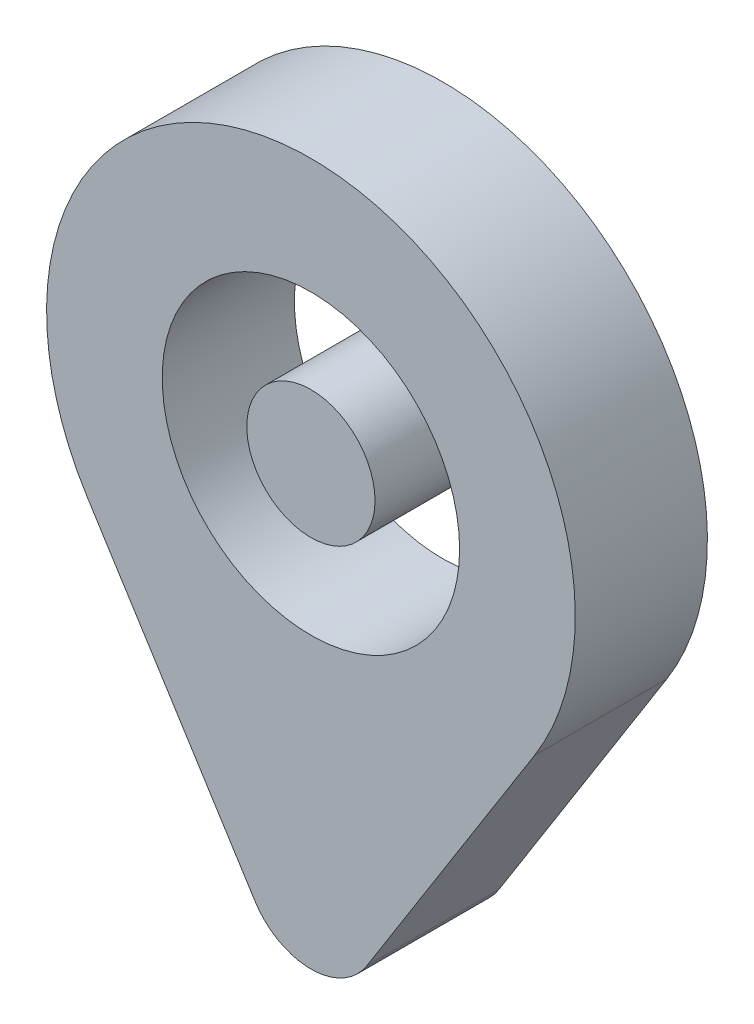
ISO-10303-21;
HEADER;
FILE_DESCRIPTION(('STEP AP214'),'2;1');
FILE_NAME('part.step','',(''),(''),'','','');
FILE_SCHEMA(('AUTOMOTIVE_DESIGN { 1 0 10303 214 1 1 1 1 }'));
ENDSEC;
DATA;
#1=APPLICATION_CONTEXT('core data for automotive mechanical design processes');
#2=APPLICATION_PROTOCOL_DEFINITION('international standard','automotive_design',2000,#1);
#3=PRODUCT_CONTEXT('',#1,'mechanical');
#4=PRODUCT('Part','Part','',(#3));
#5=PRODUCT_RELATED_PRODUCT_CATEGORY('part','',(#4));
#6=PRODUCT_DEFINITION_FORMATION('','',#4);
#7=PRODUCT_DEFINITION_CONTEXT('part definition',#1,'design');
#8=PRODUCT_DEFINITION('design','',#6,#7);
#9=PRODUCT_DEFINITION_SHAPE('','',#8);
#10=(LENGTH_UNIT() NAMED_UNIT(*) SI_UNIT(.MILLI.,.METRE.));
#11=(NAMED_UNIT(*) PLANE_ANGLE_UNIT() SI_UNIT($,.RADIAN.));
#12=(NAMED_UNIT(*) SI_UNIT($,.STERADIAN.) SOLID_ANGLE_UNIT());
#13=UNCERTAINTY_MEASURE_WITH_UNIT(LENGTH_MEASURE(1.E-05),#10,'distance_accuracy_value','');
#14=(GEOMETRIC_REPRESENTATION_CONTEXT(3) GLOBAL_UNCERTAINTY_ASSIGNED_CONTEXT((#13)) GLOBAL_UNIT_ASSIGNED_CONTEXT((#10,
#11,#12)) REPRESENTATION_CONTEXT('',''));
#15=CARTESIAN_POINT('',(0.,0.,0.));
#16=DIRECTION('',(0.,0.,1.));
#17=DIRECTION('',(1.,0.,0.));
#18=AXIS2_PLACEMENT_3D('',#15,#16,#17);
#19=CARTESIAN_POINT('',(0.,15.,-2.));
#20=DIRECTION('',(0.,0.,1.));
#21=DIRECTION('',(1.,0.,0.));
#22=AXIS2_PLACEMENT_3D('',#19,#20,#21);
#23=CYLINDRICAL_SURFACE('',#22,1.9402991177563);
#24=CARTESIAN_POINT('',(0.,15.,-2.));
#25=DIRECTION('',(0.,0.,1.));
#26=DIRECTION('',(1.,0.,0.));
#27=AXIS2_PLACEMENT_3D('',#24,#25,#26);
#28=CIRCLE('',#27,1.9402991177563);
#29=CARTESIAN_POINT('',(1.9402991177563,15.,-2.));
#30=VERTEX_POINT('',#29);
#31=EDGE_CURVE('E12',#30,#30,#28,.T.);
#32=ORIENTED_EDGE('',*,*,#31,.T.);
#33=EDGE_LOOP('',(#32));
#34=FACE_BOUND('',#33,.T.);
#35=CARTESIAN_POINT('',(0.,15.,2.));
#36=DIRECTION('',(0.,0.,1.));
#37=DIRECTION('',(1.,0.,0.));
#38=AXIS2_PLACEMENT_3D('',#35,#36,#37);
#39=CIRCLE('',#38,1.9402991177563);
#40=CARTESIAN_POINT('',(1.9402991177563,15.,2.));
#41=VERTEX_POINT('',#40);
#42=EDGE_CURVE('E77',#41,#41,#39,.T.);
#43=ORIENTED_EDGE('',*,*,#42,.F.);
#44=EDGE_LOOP('',(#43));
#45=FACE_BOUND('',#44,.T.);
#46=ADVANCED_FACE('F71',(#34,#45),#23,.T.);
#47=CARTESIAN_POINT('',(0.,0.,-2.));
#48=DIRECTION('',(0.,0.,1.));
#49=DIRECTION('',(1.,0.,0.));
#50=AXIS2_PLACEMENT_3D('',#47,#48,#49);
#51=PLANE('',#50);
#52=ORIENTED_EDGE('',*,*,#31,.F.);
#53=EDGE_LOOP('',(#52));
#54=FACE_BOUND('',#53,.T.);
#55=ADVANCED_FACE('F86',(#54),#51,.F.);
#56=CARTESIAN_POINT('',(0.,0.,2.));
#57=DIRECTION('',(0.,0.,1.));
#58=DIRECTION('',(1.,0.,0.));
#59=AXIS2_PLACEMENT_3D('',#56,#57,#58);
#60=PLANE('',#59);
#61=ORIENTED_EDGE('',*,*,#42,.T.);
#62=EDGE_LOOP('',(#61));
#63=FACE_BOUND('',#62,.T.);
#64=ADVANCED_FACE('F83',(#63),#60,.T.);
#65=CLOSED_SHELL('',(#46,#55,#64));
#66=MANIFOLD_SOLID_BREP('B2',#65);
#67=CARTESIAN_POINT('',(0.,3.75,-2.));
#68=DIRECTION('',(0.,0.,1.));
#69=DIRECTION('',(1.,0.,0.));
#70=AXIS2_PLACEMENT_3D('',#67,#68,#69);
#71=CYLINDRICAL_SURFACE('',#70,2.);
#72=DIRECTION('',(0.,0.,1.));
#73=VECTOR('',#72,1.);
#74=CARTESIAN_POINT('',(1.6918103387266,2.68333333333333,-2.));
#75=LINE('',#74,#73);
#76=CARTESIAN_POINT('',(1.6918103387266,2.68333333333333,-2.));
#77=VERTEX_POINT('',#76);
#78=CARTESIAN_POINT('',(1.6918103387266,2.68333333333333,2.));
#79=VERTEX_POINT('',#78);
#80=EDGE_CURVE('E116',#77,#79,#75,.T.);
#81=ORIENTED_EDGE('',*,*,#80,.T.);
#82=CARTESIAN_POINT('',(0.,3.75,2.));
#83=DIRECTION('',(0.,0.,1.));
#84=DIRECTION('',(1.,0.,0.));
#85=AXIS2_PLACEMENT_3D('',#82,#83,#84);
#86=CIRCLE('',#85,2.);
#87=CARTESIAN_POINT('',(-1.6918103387266,2.68333333333333,2.));
#88=VERTEX_POINT('',#87);
#89=EDGE_CURVE('E157',#79,#88,#86,.F.);
#90=ORIENTED_EDGE('',*,*,#89,.T.);
#91=DIRECTION('',(0.,0.,1.));
#92=VECTOR('',#91,1.);
#93=CARTESIAN_POINT('',(-1.6918103387266,2.68333333333333,-2.));
#94=LINE('',#93,#92);
#95=CARTESIAN_POINT('',(-1.6918103387266,2.68333333333333,-2.));
#96=VERTEX_POINT('',#95);
#97=EDGE_CURVE('E69',#96,#88,#94,.T.);
#98=ORIENTED_EDGE('',*,*,#97,.F.);
#99=CARTESIAN_POINT('',(0.,3.75,-2.));
#100=DIRECTION('',(0.,0.,1.));
#101=DIRECTION('',(1.,0.,0.));
#102=AXIS2_PLACEMENT_3D('',#99,#100,#101);
#103=CIRCLE('',#102,2.);
#104=EDGE_CURVE('E129',#77,#96,#103,.F.);
#105=ORIENTED_EDGE('',*,*,#104,.F.);
#106=EDGE_LOOP('',(#81,#90,#98,#105));
#107=FACE_BOUND('',#106,.T.);
#108=ADVANCED_FACE('F112',(#107),#71,.T.);
#109=CARTESIAN_POINT('',(0.,0.,-2.));
#110=DIRECTION('',(-0.845905169363301,-0.533333333333334,0.));
#111=DIRECTION('',(0.533333333333334,-0.845905169363301,0.));
#112=AXIS2_PLACEMENT_3D('',#109,#110,#111);
#113=PLANE('',#112);
#114=ORIENTED_EDGE('',*,*,#97,.T.);
#115=DIRECTION('',(0.533333333333334,-0.845905169363301,0.));
#116=VECTOR('',#115,1.);
#117=CARTESIAN_POINT('',(0.,0.,2.));
#118=LINE('',#117,#116);
#119=CARTESIAN_POINT('',(-6.76724135490641,10.7333333333333,2.));
#120=VERTEX_POINT('',#119);
#121=EDGE_CURVE('E172',#120,#88,#118,.T.);
#122=ORIENTED_EDGE('',*,*,#121,.F.);
#123=DIRECTION('',(0.,0.,1.));
#124=VECTOR('',#123,1.);
#125=CARTESIAN_POINT('',(-6.76724135490641,10.7333333333333,-2.));
#126=LINE('',#125,#124);
#127=CARTESIAN_POINT('',(-6.76724135490641,10.7333333333333,-2.));
#128=VERTEX_POINT('',#127);
#129=EDGE_CURVE('E121',#128,#120,#126,.T.);
#130=ORIENTED_EDGE('',*,*,#129,.F.);
#131=DIRECTION('',(0.533333333333334,-0.845905169363301,0.));
#132=VECTOR('',#131,1.);
#133=CARTESIAN_POINT('',(0.,0.,-2.));
#134=LINE('',#133,#132);
#135=EDGE_CURVE('E161',#128,#96,#134,.T.);
#136=ORIENTED_EDGE('',*,*,#135,.T.);
#137=EDGE_LOOP('',(#114,#122,#130,#136));
#138=FACE_BOUND('',#137,.T.);
#139=ADVANCED_FACE('F192',(#138),#113,.T.);
#140=CARTESIAN_POINT('',(0.,15.,-2.));
#141=DIRECTION('',(0.,0.,1.));
#142=DIRECTION('',(1.,0.,0.));
#143=AXIS2_PLACEMENT_3D('',#140,#141,#142);
#144=CYLINDRICAL_SURFACE('',#143,8.);
#145=ORIENTED_EDGE('',*,*,#129,.T.);
#146=CARTESIAN_POINT('',(0.,15.,2.));
#147=DIRECTION('',(0.,0.,1.));
#148=DIRECTION('',(1.,0.,0.));
#149=AXIS2_PLACEMENT_3D('',#146,#147,#148);
#150=CIRCLE('',#149,8.);
#151=CARTESIAN_POINT('',(6.76724135490641,10.7333333333333,2.));
#152=VERTEX_POINT('',#151);
#153=EDGE_CURVE('E168',#152,#120,#150,.T.);
#154=ORIENTED_EDGE('',*,*,#153,.F.);
#155=DIRECTION('',(0.,0.,1.));
#156=VECTOR('',#155,1.);
#157=CARTESIAN_POINT('',(6.76724135490641,10.7333333333333,-2.));
#158=LINE('',#157,#156);
#159=CARTESIAN_POINT('',(6.76724135490641,10.7333333333333,-2.));
#160=VERTEX_POINT('',#159);
#161=EDGE_CURVE('E160',#160,#152,#158,.T.);
#162=ORIENTED_EDGE('',*,*,#161,.F.);
#163=CARTESIAN_POINT('',(0.,15.,-2.));
#164=DIRECTION('',(0.,0.,1.));
#165=DIRECTION('',(1.,0.,0.));
#166=AXIS2_PLACEMENT_3D('',#163,#164,#165);
#167=CIRCLE('',#166,8.);
#168=EDGE_CURVE('E186',#160,#128,#167,.T.);
#169=ORIENTED_EDGE('',*,*,#168,.T.);
#170=EDGE_LOOP('',(#145,#154,#162,#169));
#171=FACE_BOUND('',#170,.T.);
#172=ADVANCED_FACE('F190',(#171),#144,.T.);
#173=CARTESIAN_POINT('',(0.,15.,-2.));
#174=DIRECTION('',(0.,0.,1.));
#175=DIRECTION('',(1.,0.,0.));
#176=AXIS2_PLACEMENT_3D('',#173,#174,#175);
#177=CYLINDRICAL_SURFACE('',#176,4.5);
#178=CARTESIAN_POINT('',(0.,15.,-2.));
#179=DIRECTION('',(0.,0.,1.));
#180=DIRECTION('',(1.,0.,0.));
#181=AXIS2_PLACEMENT_3D('',#178,#179,#180);
#182=CIRCLE('',#181,4.5);
#183=CARTESIAN_POINT('',(4.5,15.,-2.));
#184=VERTEX_POINT('',#183);
#185=EDGE_CURVE('E180',#184,#184,#182,.T.);
#186=ORIENTED_EDGE('',*,*,#185,.F.);
#187=EDGE_LOOP('',(#186));
#188=FACE_BOUND('',#187,.T.);
#189=CARTESIAN_POINT('',(0.,15.,2.));
#190=DIRECTION('',(0.,0.,1.));
#191=DIRECTION('',(1.,0.,0.));
#192=AXIS2_PLACEMENT_3D('',#189,#190,#191);
#193=CIRCLE('',#192,4.5);
#194=CARTESIAN_POINT('',(4.5,15.,2.));
#195=VERTEX_POINT('',#194);
#196=EDGE_CURVE('E173',#195,#195,#193,.T.);
#197=ORIENTED_EDGE('',*,*,#196,.T.);
#198=EDGE_LOOP('',(#197));
#199=FACE_BOUND('',#198,.T.);
#200=ADVANCED_FACE('F114',(#188,#199),#177,.F.);
#201=CARTESIAN_POINT('',(0.,0.,-2.));
#202=DIRECTION('',(0.845905169363301,-0.533333333333334,0.));
#203=DIRECTION('',(0.533333333333334,0.845905169363301,0.));
#204=AXIS2_PLACEMENT_3D('',#201,#202,#203);
#205=PLANE('',#204);
#206=ORIENTED_EDGE('',*,*,#161,.T.);
#207=DIRECTION('',(0.533333333333334,0.845905169363301,0.));
#208=VECTOR('',#207,1.);
#209=CARTESIAN_POINT('',(0.,0.,2.));
#210=LINE('',#209,#208);
#211=EDGE_CURVE('E163',#79,#152,#210,.T.);
#212=ORIENTED_EDGE('',*,*,#211,.F.);
#213=ORIENTED_EDGE('',*,*,#80,.F.);
#214=DIRECTION('',(0.533333333333334,0.845905169363301,0.));
#215=VECTOR('',#214,1.);
#216=CARTESIAN_POINT('',(0.,0.,-2.));
#217=LINE('',#216,#215);
#218=EDGE_CURVE('E184',#77,#160,#217,.T.);
#219=ORIENTED_EDGE('',*,*,#218,.T.);
#220=EDGE_LOOP('',(#206,#212,#213,#219));
#221=FACE_BOUND('',#220,.T.);
#222=ADVANCED_FACE('F164',(#221),#205,.T.);
#223=CARTESIAN_POINT('',(0.,0.,-2.));
#224=DIRECTION('',(0.,0.,1.));
#225=DIRECTION('',(1.,0.,0.));
#226=AXIS2_PLACEMENT_3D('',#223,#224,#225);
#227=PLANE('',#226);
#228=ORIENTED_EDGE('',*,*,#185,.T.);
#229=EDGE_LOOP('',(#228));
#230=FACE_BOUND('',#229,.T.);
#231=ORIENTED_EDGE('',*,*,#104,.T.);
#232=ORIENTED_EDGE('',*,*,#135,.F.);
#233=ORIENTED_EDGE('',*,*,#168,.F.);
#234=ORIENTED_EDGE('',*,*,#218,.F.);
#235=EDGE_LOOP('',(#231,#232,#233,#234));
#236=FACE_BOUND('',#235,.T.);
#237=ADVANCED_FACE('F193',(#230,#236),#227,.F.);
#238=CARTESIAN_POINT('',(0.,0.,2.));
#239=DIRECTION('',(0.,0.,1.));
#240=DIRECTION('',(1.,0.,0.));
#241=AXIS2_PLACEMENT_3D('',#238,#239,#240);
#242=PLANE('',#241);
#243=ORIENTED_EDGE('',*,*,#196,.F.);
#244=EDGE_LOOP('',(#243));
#245=FACE_BOUND('',#244,.T.);
#246=ORIENTED_EDGE('',*,*,#89,.F.);
#247=ORIENTED_EDGE('',*,*,#211,.T.);
#248=ORIENTED_EDGE('',*,*,#153,.T.);
#249=ORIENTED_EDGE('',*,*,#121,.T.);
#250=EDGE_LOOP('',(#246,#247,#248,#249));
#251=FACE_BOUND('',#250,.T.);
#252=ADVANCED_FACE('F171',(#245,#251),#242,.T.);
#253=CLOSED_SHELL('',(#108,#139,#172,#200,#222,#237,#252));
#254=MANIFOLD_SOLID_BREP('B7',#253);
#255=ADVANCED_BREP_SHAPE_REPRESENTATION('',(#18,#66,#254),#14);
#256=SHAPE_DEFINITION_REPRESENTATION(#9,#255);
ENDSEC;
END-ISO-10303-21;
